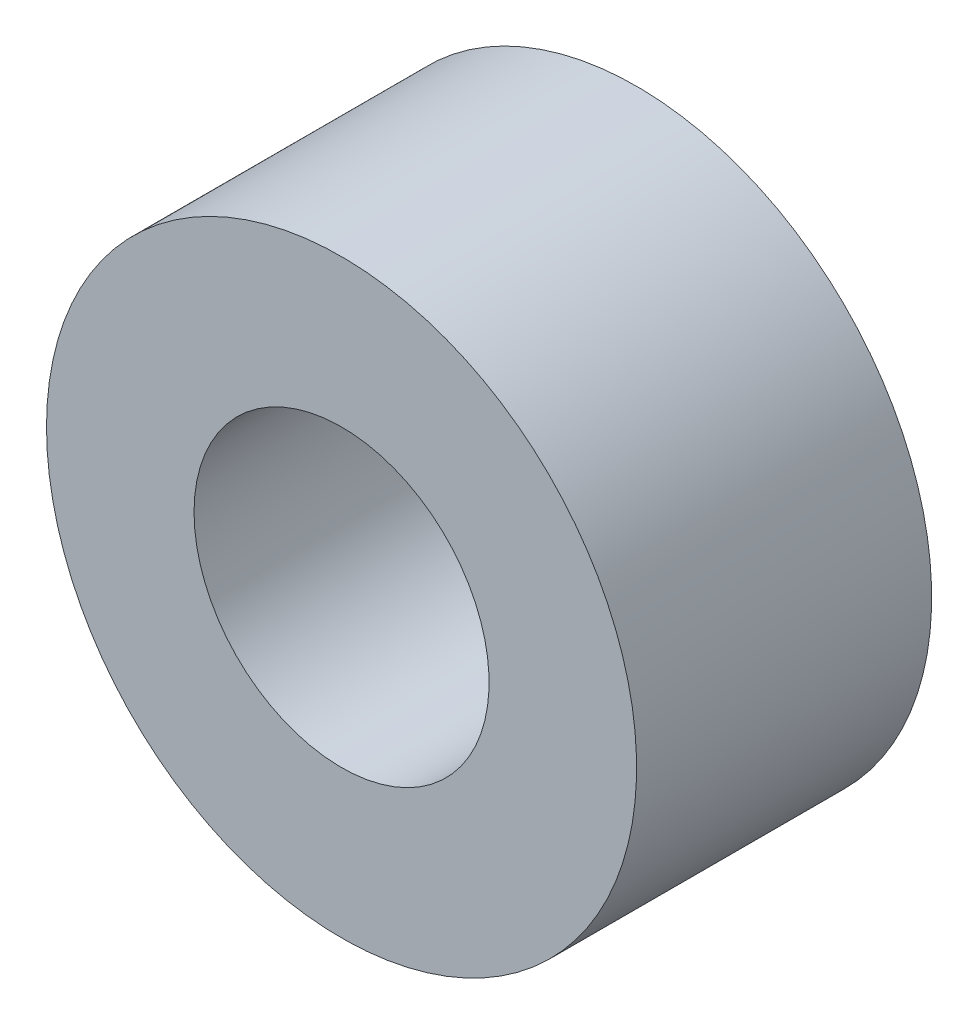
ISO-10303-21;
HEADER;
FILE_DESCRIPTION(('STEP AP214'),'2;1');
FILE_NAME('part.step','',(''),(''),'','','');
FILE_SCHEMA(('AUTOMOTIVE_DESIGN { 1 0 10303 214 1 1 1 1 }'));
ENDSEC;
DATA;
#1=APPLICATION_CONTEXT('core data for automotive mechanical design processes');
#2=APPLICATION_PROTOCOL_DEFINITION('international standard','automotive_design',2000,#1);
#3=PRODUCT_CONTEXT('',#1,'mechanical');
#4=PRODUCT('Part','Part','',(#3));
#5=PRODUCT_RELATED_PRODUCT_CATEGORY('part','',(#4));
#6=PRODUCT_DEFINITION_FORMATION('','',#4);
#7=PRODUCT_DEFINITION_CONTEXT('part definition',#1,'design');
#8=PRODUCT_DEFINITION('design','',#6,#7);
#9=PRODUCT_DEFINITION_SHAPE('','',#8);
#10=(LENGTH_UNIT() NAMED_UNIT(*) SI_UNIT(.MILLI.,.METRE.));
#11=(NAMED_UNIT(*) PLANE_ANGLE_UNIT() SI_UNIT($,.RADIAN.));
#12=(NAMED_UNIT(*) SI_UNIT($,.STERADIAN.) SOLID_ANGLE_UNIT());
#13=UNCERTAINTY_MEASURE_WITH_UNIT(LENGTH_MEASURE(1.E-05),#10,'distance_accuracy_value','');
#14=(GEOMETRIC_REPRESENTATION_CONTEXT(3) GLOBAL_UNCERTAINTY_ASSIGNED_CONTEXT((#13)) GLOBAL_UNIT_ASSIGNED_CONTEXT((#10,
#11,#12)) REPRESENTATION_CONTEXT('',''));
#15=CARTESIAN_POINT('',(0.,0.,0.));
#16=DIRECTION('',(0.,0.,1.));
#17=DIRECTION('',(1.,0.,0.));
#18=AXIS2_PLACEMENT_3D('',#15,#16,#17);
#19=CARTESIAN_POINT('',(0.,5.,-2.5));
#20=DIRECTION('',(0.,0.,-1.));
#21=DIRECTION('',(-1.,0.,0.));
#22=AXIS2_PLACEMENT_3D('',#19,#20,#21);
#23=PLANE('',#22);
#24=CARTESIAN_POINT('',(0.,0.,-2.5));
#25=DIRECTION('',(0.,0.,-1.));
#26=DIRECTION('',(-1.,0.,0.));
#27=AXIS2_PLACEMENT_3D('',#24,#25,#26);
#28=CIRCLE('',#27,5.);
#29=CARTESIAN_POINT('',(-5.,0.,-2.5));
#30=VERTEX_POINT('',#29);
#31=EDGE_CURVE('E10',#30,#30,#28,.T.);
#32=ORIENTED_EDGE('',*,*,#31,.T.);
#33=EDGE_LOOP('',(#32));
#34=FACE_BOUND('',#33,.T.);
#35=CARTESIAN_POINT('',(0.,0.,-2.5));
#36=DIRECTION('',(0.,0.,-1.));
#37=DIRECTION('',(-1.,0.,0.));
#38=AXIS2_PLACEMENT_3D('',#35,#36,#37);
#39=CIRCLE('',#38,2.5);
#40=CARTESIAN_POINT('',(-2.5,0.,-2.5));
#41=VERTEX_POINT('',#40);
#42=EDGE_CURVE('E52',#41,#41,#39,.T.);
#43=ORIENTED_EDGE('',*,*,#42,.F.);
#44=EDGE_LOOP('',(#43));
#45=FACE_BOUND('',#44,.T.);
#46=ADVANCED_FACE('F38',(#34,#45),#23,.T.);
#47=CARTESIAN_POINT('',(0.,0.,0.));
#48=DIRECTION('',(0.,0.,-1.));
#49=DIRECTION('',(-1.,0.,0.));
#50=AXIS2_PLACEMENT_3D('',#47,#48,#49);
#51=CYLINDRICAL_SURFACE('',#50,5.);
#52=CARTESIAN_POINT('',(0.,0.,2.5));
#53=DIRECTION('',(0.,0.,-1.));
#54=DIRECTION('',(-1.,0.,0.));
#55=AXIS2_PLACEMENT_3D('',#52,#53,#54);
#56=CIRCLE('',#55,5.);
#57=CARTESIAN_POINT('',(-5.,0.,2.5));
#58=VERTEX_POINT('',#57);
#59=EDGE_CURVE('E44',#58,#58,#56,.T.);
#60=ORIENTED_EDGE('',*,*,#59,.T.);
#61=EDGE_LOOP('',(#60));
#62=FACE_BOUND('',#61,.T.);
#63=ORIENTED_EDGE('',*,*,#31,.F.);
#64=EDGE_LOOP('',(#63));
#65=FACE_BOUND('',#64,.T.);
#66=ADVANCED_FACE('F62',(#62,#65),#51,.T.);
#67=CARTESIAN_POINT('',(0.,5.,2.5));
#68=DIRECTION('',(0.,0.,1.));
#69=DIRECTION('',(1.,0.,0.));
#70=AXIS2_PLACEMENT_3D('',#67,#68,#69);
#71=PLANE('',#70);
#72=CARTESIAN_POINT('',(0.,0.,2.5));
#73=DIRECTION('',(0.,0.,-1.));
#74=DIRECTION('',(-1.,0.,0.));
#75=AXIS2_PLACEMENT_3D('',#72,#73,#74);
#76=CIRCLE('',#75,2.5);
#77=CARTESIAN_POINT('',(-2.5,0.,2.5));
#78=VERTEX_POINT('',#77);
#79=EDGE_CURVE('E48',#78,#78,#76,.T.);
#80=ORIENTED_EDGE('',*,*,#79,.T.);
#81=EDGE_LOOP('',(#80));
#82=FACE_BOUND('',#81,.T.);
#83=ORIENTED_EDGE('',*,*,#59,.F.);
#84=EDGE_LOOP('',(#83));
#85=FACE_BOUND('',#84,.T.);
#86=ADVANCED_FACE('F66',(#82,#85),#71,.T.);
#87=CARTESIAN_POINT('',(0.,0.,0.));
#88=DIRECTION('',(0.,0.,-1.));
#89=DIRECTION('',(-1.,0.,0.));
#90=AXIS2_PLACEMENT_3D('',#87,#88,#89);
#91=CYLINDRICAL_SURFACE('',#90,2.5);
#92=ORIENTED_EDGE('',*,*,#42,.T.);
#93=EDGE_LOOP('',(#92));
#94=FACE_BOUND('',#93,.T.);
#95=ORIENTED_EDGE('',*,*,#79,.F.);
#96=EDGE_LOOP('',(#95));
#97=FACE_BOUND('',#96,.T.);
#98=ADVANCED_FACE('F58',(#94,#97),#91,.F.);
#99=CLOSED_SHELL('',(#46,#66,#86,#98));
#100=MANIFOLD_SOLID_BREP('B2',#99);
#101=ADVANCED_BREP_SHAPE_REPRESENTATION('',(#18,#100),#14);
#102=SHAPE_DEFINITION_REPRESENTATION(#9,#101);
ENDSEC;
END-ISO-10303-21;
